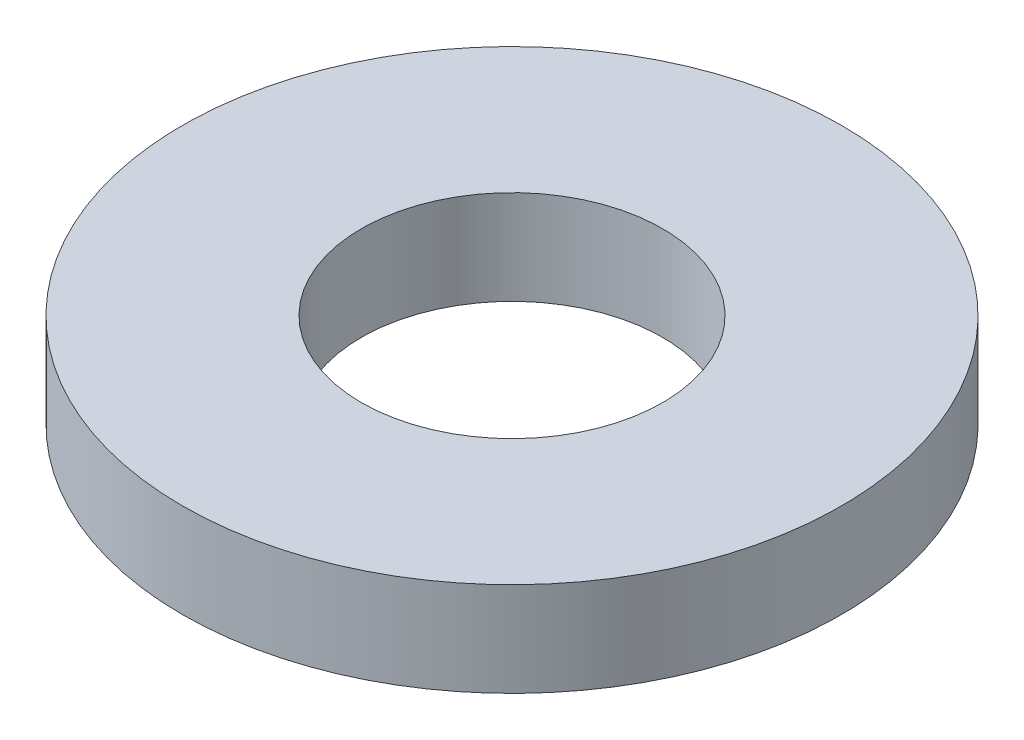
ISO-10303-21;
HEADER;
FILE_DESCRIPTION(('STEP AP214'),'2;1');
FILE_NAME('part.step','',(''),(''),'','','');
FILE_SCHEMA(('AUTOMOTIVE_DESIGN { 1 0 10303 214 1 1 1 1 }'));
ENDSEC;
DATA;
#1=APPLICATION_CONTEXT('core data for automotive mechanical design processes');
#2=APPLICATION_PROTOCOL_DEFINITION('international standard','automotive_design',2000,#1);
#3=PRODUCT_CONTEXT('',#1,'mechanical');
#4=PRODUCT('Part','Part','',(#3));
#5=PRODUCT_RELATED_PRODUCT_CATEGORY('part','',(#4));
#6=PRODUCT_DEFINITION_FORMATION('','',#4);
#7=PRODUCT_DEFINITION_CONTEXT('part definition',#1,'design');
#8=PRODUCT_DEFINITION('design','',#6,#7);
#9=PRODUCT_DEFINITION_SHAPE('','',#8);
#10=(LENGTH_UNIT() NAMED_UNIT(*) SI_UNIT(.MILLI.,.METRE.));
#11=(NAMED_UNIT(*) PLANE_ANGLE_UNIT() SI_UNIT($,.RADIAN.));
#12=(NAMED_UNIT(*) SI_UNIT($,.STERADIAN.) SOLID_ANGLE_UNIT());
#13=UNCERTAINTY_MEASURE_WITH_UNIT(LENGTH_MEASURE(1.E-05),#10,'distance_accuracy_value','');
#14=(GEOMETRIC_REPRESENTATION_CONTEXT(3) GLOBAL_UNCERTAINTY_ASSIGNED_CONTEXT((#13)) GLOBAL_UNIT_ASSIGNED_CONTEXT((#10,
#11,#12)) REPRESENTATION_CONTEXT('',''));
#15=CARTESIAN_POINT('',(0.,0.,0.));
#16=DIRECTION('',(0.,0.,1.));
#17=DIRECTION('',(1.,0.,0.));
#18=AXIS2_PLACEMENT_3D('',#15,#16,#17);
#19=CARTESIAN_POINT('',(0.,1.,0.));
#20=DIRECTION('',(0.,1.,0.));
#21=DIRECTION('',(0.,0.,1.));
#22=AXIS2_PLACEMENT_3D('',#19,#20,#21);
#23=PLANE('',#22);
#24=CARTESIAN_POINT('',(0.,1.,0.));
#25=DIRECTION('',(0.,1.,0.));
#26=DIRECTION('',(0.,0.,1.));
#27=AXIS2_PLACEMENT_3D('',#24,#25,#26);
#28=CIRCLE('',#27,3.5);
#29=CARTESIAN_POINT('',(0.,1.,3.5));
#30=VERTEX_POINT('',#29);
#31=EDGE_CURVE('E10',#30,#30,#28,.T.);
#32=ORIENTED_EDGE('',*,*,#31,.T.);
#33=EDGE_LOOP('',(#32));
#34=FACE_BOUND('',#33,.T.);
#35=CARTESIAN_POINT('',(0.,1.,0.));
#36=DIRECTION('',(0.,1.,0.));
#37=DIRECTION('',(0.,0.,1.));
#38=AXIS2_PLACEMENT_3D('',#35,#36,#37);
#39=CIRCLE('',#38,1.6);
#40=CARTESIAN_POINT('',(0.,1.,1.6));
#41=VERTEX_POINT('',#40);
#42=EDGE_CURVE('E50',#41,#41,#39,.T.);
#43=ORIENTED_EDGE('',*,*,#42,.F.);
#44=EDGE_LOOP('',(#43));
#45=FACE_BOUND('',#44,.T.);
#46=ADVANCED_FACE('F37',(#34,#45),#23,.T.);
#47=CARTESIAN_POINT('',(0.,0.,0.));
#48=DIRECTION('',(0.,1.,0.));
#49=DIRECTION('',(0.,0.,1.));
#50=AXIS2_PLACEMENT_3D('',#47,#48,#49);
#51=PLANE('',#50);
#52=CARTESIAN_POINT('',(0.,0.,0.));
#53=DIRECTION('',(0.,1.,0.));
#54=DIRECTION('',(0.,0.,1.));
#55=AXIS2_PLACEMENT_3D('',#52,#53,#54);
#56=CIRCLE('',#55,3.5);
#57=CARTESIAN_POINT('',(0.,0.,3.5));
#58=VERTEX_POINT('',#57);
#59=EDGE_CURVE('E41',#58,#58,#56,.T.);
#60=ORIENTED_EDGE('',*,*,#59,.F.);
#61=EDGE_LOOP('',(#60));
#62=FACE_BOUND('',#61,.T.);
#63=CARTESIAN_POINT('',(0.,0.,0.));
#64=DIRECTION('',(0.,1.,0.));
#65=DIRECTION('',(0.,0.,1.));
#66=AXIS2_PLACEMENT_3D('',#63,#64,#65);
#67=CIRCLE('',#66,1.6);
#68=CARTESIAN_POINT('',(0.,0.,1.6));
#69=VERTEX_POINT('',#68);
#70=EDGE_CURVE('E52',#69,#69,#67,.T.);
#71=ORIENTED_EDGE('',*,*,#70,.T.);
#72=EDGE_LOOP('',(#71));
#73=FACE_BOUND('',#72,.T.);
#74=ADVANCED_FACE('F64',(#62,#73),#51,.F.);
#75=CARTESIAN_POINT('',(0.,1.,0.));
#76=DIRECTION('',(0.,-1.,0.));
#77=DIRECTION('',(0.,0.,-1.));
#78=AXIS2_PLACEMENT_3D('',#75,#76,#77);
#79=CYLINDRICAL_SURFACE('',#78,3.5);
#80=ORIENTED_EDGE('',*,*,#31,.F.);
#81=EDGE_LOOP('',(#80));
#82=FACE_BOUND('',#81,.T.);
#83=ORIENTED_EDGE('',*,*,#59,.T.);
#84=EDGE_LOOP('',(#83));
#85=FACE_BOUND('',#84,.T.);
#86=ADVANCED_FACE('F39',(#82,#85),#79,.T.);
#87=CARTESIAN_POINT('',(0.,1.,0.));
#88=DIRECTION('',(0.,-1.,0.));
#89=DIRECTION('',(0.,0.,-1.));
#90=AXIS2_PLACEMENT_3D('',#87,#88,#89);
#91=CYLINDRICAL_SURFACE('',#90,1.6);
#92=ORIENTED_EDGE('',*,*,#42,.T.);
#93=EDGE_LOOP('',(#92));
#94=FACE_BOUND('',#93,.T.);
#95=ORIENTED_EDGE('',*,*,#70,.F.);
#96=EDGE_LOOP('',(#95));
#97=FACE_BOUND('',#96,.T.);
#98=ADVANCED_FACE('F60',(#94,#97),#91,.F.);
#99=CLOSED_SHELL('',(#46,#74,#86,#98));
#100=MANIFOLD_SOLID_BREP('B2',#99);
#101=ADVANCED_BREP_SHAPE_REPRESENTATION('',(#18,#100),#14);
#102=SHAPE_DEFINITION_REPRESENTATION(#9,#101);
ENDSEC;
END-ISO-10303-21;
